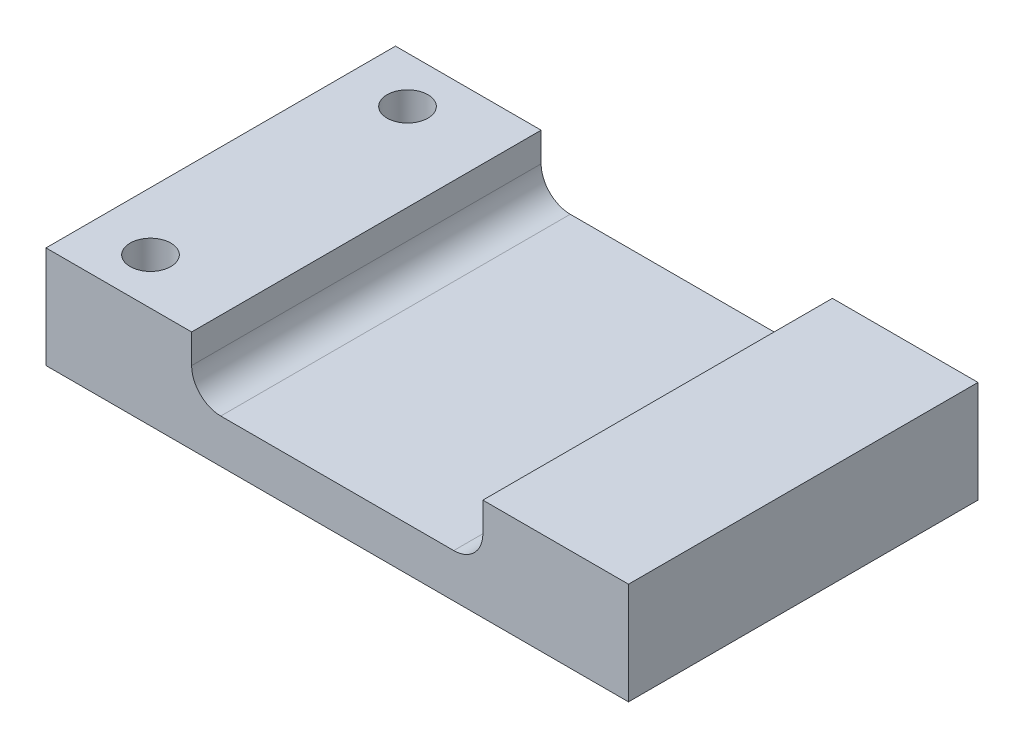
ISO-10303-21;
HEADER;
FILE_DESCRIPTION(('STEP AP214'),'2;1');
FILE_NAME('part.step','',(''),(''),'','','');
FILE_SCHEMA(('AUTOMOTIVE_DESIGN { 1 0 10303 214 1 1 1 1 }'));
ENDSEC;
DATA;
#1=APPLICATION_CONTEXT('core data for automotive mechanical design processes');
#2=APPLICATION_PROTOCOL_DEFINITION('international standard','automotive_design',2000,#1);
#3=PRODUCT_CONTEXT('',#1,'mechanical');
#4=PRODUCT('Part','Part','',(#3));
#5=PRODUCT_RELATED_PRODUCT_CATEGORY('part','',(#4));
#6=PRODUCT_DEFINITION_FORMATION('','',#4);
#7=PRODUCT_DEFINITION_CONTEXT('part definition',#1,'design');
#8=PRODUCT_DEFINITION('design','',#6,#7);
#9=PRODUCT_DEFINITION_SHAPE('','',#8);
#10=(LENGTH_UNIT() NAMED_UNIT(*) SI_UNIT(.MILLI.,.METRE.));
#11=(NAMED_UNIT(*) PLANE_ANGLE_UNIT() SI_UNIT($,.RADIAN.));
#12=(NAMED_UNIT(*) SI_UNIT($,.STERADIAN.) SOLID_ANGLE_UNIT());
#13=UNCERTAINTY_MEASURE_WITH_UNIT(LENGTH_MEASURE(1.E-05),#10,'distance_accuracy_value','');
#14=(GEOMETRIC_REPRESENTATION_CONTEXT(3) GLOBAL_UNCERTAINTY_ASSIGNED_CONTEXT((#13)) GLOBAL_UNIT_ASSIGNED_CONTEXT((#10,
#11,#12)) REPRESENTATION_CONTEXT('',''));
#15=CARTESIAN_POINT('',(0.,0.,0.));
#16=DIRECTION('',(0.,0.,1.));
#17=DIRECTION('',(1.,0.,0.));
#18=AXIS2_PLACEMENT_3D('',#15,#16,#17);
#19=CARTESIAN_POINT('',(-16.,7.,-8.825));
#20=DIRECTION('',(0.,-1.,0.));
#21=DIRECTION('',(0.,0.,-1.));
#22=AXIS2_PLACEMENT_3D('',#19,#20,#21);
#23=CYLINDRICAL_SURFACE('',#22,1.4);
#24=CARTESIAN_POINT('',(-16.,7.,-8.825));
#25=DIRECTION('',(0.,1.,0.));
#26=DIRECTION('',(0.,0.,1.));
#27=AXIS2_PLACEMENT_3D('',#24,#25,#26);
#28=CIRCLE('',#27,1.4);
#29=CARTESIAN_POINT('',(-16.,7.,-7.425));
#30=VERTEX_POINT('',#29);
#31=EDGE_CURVE('E307',#30,#30,#28,.T.);
#32=ORIENTED_EDGE('',*,*,#31,.T.);
#33=EDGE_LOOP('',(#32));
#34=FACE_BOUND('',#33,.T.);
#35=CARTESIAN_POINT('',(-16.,2.5,-8.825));
#36=DIRECTION('',(0.,-1.,0.));
#37=DIRECTION('',(0.,0.,-1.));
#38=AXIS2_PLACEMENT_3D('',#35,#36,#37);
#39=CIRCLE('',#38,1.4);
#40=CARTESIAN_POINT('',(-16.,2.5,-10.225));
#41=VERTEX_POINT('',#40);
#42=EDGE_CURVE('E37',#41,#41,#39,.T.);
#43=ORIENTED_EDGE('',*,*,#42,.T.);
#44=EDGE_LOOP('',(#43));
#45=FACE_BOUND('',#44,.T.);
#46=ADVANCED_FACE('F33',(#34,#45),#23,.F.);
#47=CARTESIAN_POINT('',(-16.,7.,8.825));
#48=DIRECTION('',(0.,-1.,0.));
#49=DIRECTION('',(0.,0.,-1.));
#50=AXIS2_PLACEMENT_3D('',#47,#48,#49);
#51=CYLINDRICAL_SURFACE('',#50,1.4);
#52=CARTESIAN_POINT('',(-16.,7.,8.825));
#53=DIRECTION('',(0.,1.,0.));
#54=DIRECTION('',(0.,0.,1.));
#55=AXIS2_PLACEMENT_3D('',#52,#53,#54);
#56=CIRCLE('',#55,1.4);
#57=CARTESIAN_POINT('',(-16.,7.,10.225));
#58=VERTEX_POINT('',#57);
#59=EDGE_CURVE('E299',#58,#58,#56,.T.);
#60=ORIENTED_EDGE('',*,*,#59,.T.);
#61=EDGE_LOOP('',(#60));
#62=FACE_BOUND('',#61,.T.);
#63=CARTESIAN_POINT('',(-16.,2.5,8.825));
#64=DIRECTION('',(0.,-1.,0.));
#65=DIRECTION('',(0.,0.,-1.));
#66=AXIS2_PLACEMENT_3D('',#63,#64,#65);
#67=CIRCLE('',#66,1.4);
#68=CARTESIAN_POINT('',(-16.,2.5,7.425));
#69=VERTEX_POINT('',#68);
#70=EDGE_CURVE('E274',#69,#69,#67,.T.);
#71=ORIENTED_EDGE('',*,*,#70,.T.);
#72=EDGE_LOOP('',(#71));
#73=FACE_BOUND('',#72,.T.);
#74=ADVANCED_FACE('F361',(#62,#73),#51,.F.);
#75=CARTESIAN_POINT('',(0.,7.,0.));
#76=DIRECTION('',(0.,1.,0.));
#77=DIRECTION('',(0.,0.,1.));
#78=AXIS2_PLACEMENT_3D('',#75,#76,#77);
#79=PLANE('',#78);
#80=DIRECTION('',(0.,0.,1.));
#81=VECTOR('',#80,1.);
#82=CARTESIAN_POINT('',(-9.99999999999999,7.,12.));
#83=LINE('',#82,#81);
#84=CARTESIAN_POINT('',(-10.,7.,-12.));
#85=VERTEX_POINT('',#84);
#86=CARTESIAN_POINT('',(-9.99999999999999,7.,12.));
#87=VERTEX_POINT('',#86);
#88=EDGE_CURVE('E292',#85,#87,#83,.T.);
#89=ORIENTED_EDGE('',*,*,#88,.F.);
#90=DIRECTION('',(-1.,0.,0.));
#91=VECTOR('',#90,1.);
#92=CARTESIAN_POINT('',(-20.,7.,-12.));
#93=LINE('',#92,#91);
#94=CARTESIAN_POINT('',(-20.,7.,-12.));
#95=VERTEX_POINT('',#94);
#96=EDGE_CURVE('E321',#85,#95,#93,.T.);
#97=ORIENTED_EDGE('',*,*,#96,.T.);
#98=DIRECTION('',(0.,0.,1.));
#99=VECTOR('',#98,1.);
#100=CARTESIAN_POINT('',(-20.,7.,-12.));
#101=LINE('',#100,#99);
#102=CARTESIAN_POINT('',(-20.,7.,12.));
#103=VERTEX_POINT('',#102);
#104=EDGE_CURVE('E311',#95,#103,#101,.T.);
#105=ORIENTED_EDGE('',*,*,#104,.T.);
#106=DIRECTION('',(1.,0.,0.));
#107=VECTOR('',#106,1.);
#108=CARTESIAN_POINT('',(-20.,7.,12.));
#109=LINE('',#108,#107);
#110=EDGE_CURVE('E316',#103,#87,#109,.T.);
#111=ORIENTED_EDGE('',*,*,#110,.T.);
#112=EDGE_LOOP('',(#89,#97,#105,#111));
#113=FACE_BOUND('',#112,.T.);
#114=ORIENTED_EDGE('',*,*,#31,.F.);
#115=EDGE_LOOP('',(#114));
#116=FACE_BOUND('',#115,.T.);
#117=ORIENTED_EDGE('',*,*,#59,.F.);
#118=EDGE_LOOP('',(#117));
#119=FACE_BOUND('',#118,.T.);
#120=ADVANCED_FACE('F422',(#113,#116,#119),#79,.T.);
#121=DIRECTION('',(0.,0.,-1.));
#122=VECTOR('',#121,1.);
#123=CARTESIAN_POINT('',(10.,7.,-12.));
#124=LINE('',#123,#122);
#125=CARTESIAN_POINT('',(10.,7.,12.));
#126=VERTEX_POINT('',#125);
#127=CARTESIAN_POINT('',(10.,7.,-12.));
#128=VERTEX_POINT('',#127);
#129=EDGE_CURVE('E288',#126,#128,#124,.T.);
#130=ORIENTED_EDGE('',*,*,#129,.F.);
#131=CARTESIAN_POINT('',(20.,7.,12.));
#132=VERTEX_POINT('',#131);
#133=EDGE_CURVE('E314',#126,#132,#109,.T.);
#134=ORIENTED_EDGE('',*,*,#133,.T.);
#135=DIRECTION('',(0.,0.,-1.));
#136=VECTOR('',#135,1.);
#137=CARTESIAN_POINT('',(20.,7.,-12.));
#138=LINE('',#137,#136);
#139=CARTESIAN_POINT('',(20.,7.,-12.));
#140=VERTEX_POINT('',#139);
#141=EDGE_CURVE('E319',#132,#140,#138,.T.);
#142=ORIENTED_EDGE('',*,*,#141,.T.);
#143=EDGE_CURVE('E322',#140,#128,#93,.T.);
#144=ORIENTED_EDGE('',*,*,#143,.T.);
#145=EDGE_LOOP('',(#130,#134,#142,#144));
#146=FACE_BOUND('',#145,.T.);
#147=ADVANCED_FACE('F394',(#146),#79,.T.);
#148=CARTESIAN_POINT('',(0.,0.,0.));
#149=DIRECTION('',(0.,1.,0.));
#150=DIRECTION('',(0.,0.,1.));
#151=AXIS2_PLACEMENT_3D('',#148,#149,#150);
#152=PLANE('',#151);
#153=DIRECTION('',(0.5,0.,0.866025403784439));
#154=VECTOR('',#153,1.);
#155=CARTESIAN_POINT('',(-14.498889300107,0.,-11.425));
#156=LINE('',#155,#154);
#157=CARTESIAN_POINT('',(-14.498889300107,0.,-11.425));
#158=VERTEX_POINT('',#157);
#159=CARTESIAN_POINT('',(-12.9977786002139,0.,-8.82500000000001));
#160=VERTEX_POINT('',#159);
#161=EDGE_CURVE('E218',#158,#160,#156,.T.);
#162=ORIENTED_EDGE('',*,*,#161,.F.);
#163=DIRECTION('',(1.,0.,0.));
#164=VECTOR('',#163,1.);
#165=CARTESIAN_POINT('',(-17.501110699893,0.,-11.425));
#166=LINE('',#165,#164);
#167=CARTESIAN_POINT('',(-17.501110699893,0.,-11.425));
#168=VERTEX_POINT('',#167);
#169=EDGE_CURVE('E50',#168,#158,#166,.T.);
#170=ORIENTED_EDGE('',*,*,#169,.F.);
#171=DIRECTION('',(0.5,0.,-0.866025403784439));
#172=VECTOR('',#171,1.);
#173=CARTESIAN_POINT('',(-19.0022213997861,0.,-8.825));
#174=LINE('',#173,#172);
#175=CARTESIAN_POINT('',(-19.0022213997861,0.,-8.825));
#176=VERTEX_POINT('',#175);
#177=EDGE_CURVE('E204',#176,#168,#174,.T.);
#178=ORIENTED_EDGE('',*,*,#177,.F.);
#179=DIRECTION('',(-0.5,0.,-0.866025403784438));
#180=VECTOR('',#179,1.);
#181=CARTESIAN_POINT('',(-17.501110699893,0.,-6.225));
#182=LINE('',#181,#180);
#183=CARTESIAN_POINT('',(-17.501110699893,0.,-6.225));
#184=VERTEX_POINT('',#183);
#185=EDGE_CURVE('E207',#184,#176,#182,.T.);
#186=ORIENTED_EDGE('',*,*,#185,.F.);
#187=DIRECTION('',(-1.,0.,0.));
#188=VECTOR('',#187,1.);
#189=CARTESIAN_POINT('',(-14.498889300107,0.,-6.225));
#190=LINE('',#189,#188);
#191=CARTESIAN_POINT('',(-14.498889300107,0.,-6.225));
#192=VERTEX_POINT('',#191);
#193=EDGE_CURVE('E223',#192,#184,#190,.T.);
#194=ORIENTED_EDGE('',*,*,#193,.F.);
#195=DIRECTION('',(-0.500000000000001,0.,0.866025403784438));
#196=VECTOR('',#195,1.);
#197=CARTESIAN_POINT('',(-12.9977786002139,0.,-8.82500000000001));
#198=LINE('',#197,#196);
#199=EDGE_CURVE('E220',#160,#192,#198,.T.);
#200=ORIENTED_EDGE('',*,*,#199,.F.);
#201=EDGE_LOOP('',(#162,#170,#178,#186,#194,#200));
#202=FACE_BOUND('',#201,.T.);
#203=DIRECTION('',(0.5,0.,0.866025403784438));
#204=VECTOR('',#203,1.);
#205=CARTESIAN_POINT('',(-14.498889300107,0.,6.225));
#206=LINE('',#205,#204);
#207=CARTESIAN_POINT('',(-14.498889300107,0.,6.225));
#208=VERTEX_POINT('',#207);
#209=CARTESIAN_POINT('',(-12.9977786002139,0.,8.825));
#210=VERTEX_POINT('',#209);
#211=EDGE_CURVE('E258',#208,#210,#206,.T.);
#212=ORIENTED_EDGE('',*,*,#211,.F.);
#213=DIRECTION('',(1.,0.,0.));
#214=VECTOR('',#213,1.);
#215=CARTESIAN_POINT('',(-17.501110699893,0.,6.225));
#216=LINE('',#215,#214);
#217=CARTESIAN_POINT('',(-17.501110699893,0.,6.225));
#218=VERTEX_POINT('',#217);
#219=EDGE_CURVE('E58',#218,#208,#216,.T.);
#220=ORIENTED_EDGE('',*,*,#219,.F.);
#221=DIRECTION('',(0.5,0.,-0.866025403784438));
#222=VECTOR('',#221,1.);
#223=CARTESIAN_POINT('',(-19.0022213997861,0.,8.825));
#224=LINE('',#223,#222);
#225=CARTESIAN_POINT('',(-19.0022213997861,0.,8.825));
#226=VERTEX_POINT('',#225);
#227=EDGE_CURVE('E241',#226,#218,#224,.T.);
#228=ORIENTED_EDGE('',*,*,#227,.F.);
#229=DIRECTION('',(-0.499999999999999,0.,-0.866025403784439));
#230=VECTOR('',#229,1.);
#231=CARTESIAN_POINT('',(-17.501110699893,0.,11.425));
#232=LINE('',#231,#230);
#233=CARTESIAN_POINT('',(-17.501110699893,0.,11.425));
#234=VERTEX_POINT('',#233);
#235=EDGE_CURVE('E267',#234,#226,#232,.T.);
#236=ORIENTED_EDGE('',*,*,#235,.F.);
#237=DIRECTION('',(-1.,0.,0.));
#238=VECTOR('',#237,1.);
#239=CARTESIAN_POINT('',(-14.498889300107,0.,11.425));
#240=LINE('',#239,#238);
#241=CARTESIAN_POINT('',(-14.498889300107,0.,11.425));
#242=VERTEX_POINT('',#241);
#243=EDGE_CURVE('E264',#242,#234,#240,.T.);
#244=ORIENTED_EDGE('',*,*,#243,.F.);
#245=DIRECTION('',(-0.5,0.,0.866025403784439));
#246=VECTOR('',#245,1.);
#247=CARTESIAN_POINT('',(-12.9977786002139,0.,8.825));
#248=LINE('',#247,#246);
#249=EDGE_CURVE('E261',#210,#242,#248,.T.);
#250=ORIENTED_EDGE('',*,*,#249,.F.);
#251=EDGE_LOOP('',(#212,#220,#228,#236,#244,#250));
#252=FACE_BOUND('',#251,.T.);
#253=DIRECTION('',(0.,0.,1.));
#254=VECTOR('',#253,1.);
#255=CARTESIAN_POINT('',(-20.,0.,-12.));
#256=LINE('',#255,#254);
#257=CARTESIAN_POINT('',(-20.,0.,-12.));
#258=VERTEX_POINT('',#257);
#259=CARTESIAN_POINT('',(-20.,0.,12.));
#260=VERTEX_POINT('',#259);
#261=EDGE_CURVE('E310',#258,#260,#256,.T.);
#262=ORIENTED_EDGE('',*,*,#261,.F.);
#263=DIRECTION('',(-1.,0.,0.));
#264=VECTOR('',#263,1.);
#265=CARTESIAN_POINT('',(-20.,0.,-12.));
#266=LINE('',#265,#264);
#267=CARTESIAN_POINT('',(20.,0.,-12.));
#268=VERTEX_POINT('',#267);
#269=EDGE_CURVE('E315',#268,#258,#266,.T.);
#270=ORIENTED_EDGE('',*,*,#269,.F.);
#271=DIRECTION('',(0.,0.,-1.));
#272=VECTOR('',#271,1.);
#273=CARTESIAN_POINT('',(20.,0.,-12.));
#274=LINE('',#273,#272);
#275=CARTESIAN_POINT('',(20.,0.,12.));
#276=VERTEX_POINT('',#275);
#277=EDGE_CURVE('E330',#276,#268,#274,.T.);
#278=ORIENTED_EDGE('',*,*,#277,.F.);
#279=DIRECTION('',(1.,0.,0.));
#280=VECTOR('',#279,1.);
#281=CARTESIAN_POINT('',(-20.,0.,12.));
#282=LINE('',#281,#280);
#283=EDGE_CURVE('E328',#260,#276,#282,.T.);
#284=ORIENTED_EDGE('',*,*,#283,.F.);
#285=EDGE_LOOP('',(#262,#270,#278,#284));
#286=FACE_BOUND('',#285,.T.);
#287=ADVANCED_FACE('F390',(#202,#252,#286),#152,.F.);
#288=CARTESIAN_POINT('',(-20.,7.,-12.));
#289=DIRECTION('',(1.,0.,0.));
#290=DIRECTION('',(0.,0.,-1.));
#291=AXIS2_PLACEMENT_3D('',#288,#289,#290);
#292=PLANE('',#291);
#293=ORIENTED_EDGE('',*,*,#261,.T.);
#294=DIRECTION('',(0.,-1.,0.));
#295=VECTOR('',#294,1.);
#296=CARTESIAN_POINT('',(-20.,7.,12.));
#297=LINE('',#296,#295);
#298=EDGE_CURVE('E341',#103,#260,#297,.T.);
#299=ORIENTED_EDGE('',*,*,#298,.F.);
#300=ORIENTED_EDGE('',*,*,#104,.F.);
#301=DIRECTION('',(0.,-1.,0.));
#302=VECTOR('',#301,1.);
#303=CARTESIAN_POINT('',(-20.,7.,-12.));
#304=LINE('',#303,#302);
#305=EDGE_CURVE('E325',#95,#258,#304,.T.);
#306=ORIENTED_EDGE('',*,*,#305,.T.);
#307=EDGE_LOOP('',(#293,#299,#300,#306));
#308=FACE_BOUND('',#307,.T.);
#309=ADVANCED_FACE('F393',(#308),#292,.F.);
#310=CARTESIAN_POINT('',(-20.,7.,12.));
#311=DIRECTION('',(0.,0.,-1.));
#312=DIRECTION('',(-1.,0.,0.));
#313=AXIS2_PLACEMENT_3D('',#310,#311,#312);
#314=PLANE('',#313);
#315=DIRECTION('',(1.,0.,0.));
#316=VECTOR('',#315,1.);
#317=CARTESIAN_POINT('',(10.,3.,12.));
#318=LINE('',#317,#316);
#319=CARTESIAN_POINT('',(-7.99999999999999,3.,12.));
#320=VERTEX_POINT('',#319);
#321=CARTESIAN_POINT('',(8.,3.,12.));
#322=VERTEX_POINT('',#321);
#323=EDGE_CURVE('E284',#320,#322,#318,.T.);
#324=ORIENTED_EDGE('',*,*,#323,.F.);
#325=CARTESIAN_POINT('',(-7.99999999999999,5.,12.));
#326=DIRECTION('',(0.,0.,-1.));
#327=DIRECTION('',(-1.,0.,0.));
#328=AXIS2_PLACEMENT_3D('',#325,#326,#327);
#329=CIRCLE('',#328,2.);
#330=CARTESIAN_POINT('',(-9.99999999999999,5.,12.));
#331=VERTEX_POINT('',#330);
#332=EDGE_CURVE('E42',#320,#331,#329,.T.);
#333=ORIENTED_EDGE('',*,*,#332,.T.);
#334=DIRECTION('',(0.,1.,0.));
#335=VECTOR('',#334,1.);
#336=CARTESIAN_POINT('',(-9.99999999999999,3.,12.));
#337=LINE('',#336,#335);
#338=EDGE_CURVE('E291',#331,#87,#337,.T.);
#339=ORIENTED_EDGE('',*,*,#338,.T.);
#340=ORIENTED_EDGE('',*,*,#110,.F.);
#341=ORIENTED_EDGE('',*,*,#298,.T.);
#342=ORIENTED_EDGE('',*,*,#283,.T.);
#343=DIRECTION('',(0.,-1.,0.));
#344=VECTOR('',#343,1.);
#345=CARTESIAN_POINT('',(20.,7.,12.));
#346=LINE('',#345,#344);
#347=EDGE_CURVE('E338',#132,#276,#346,.T.);
#348=ORIENTED_EDGE('',*,*,#347,.F.);
#349=ORIENTED_EDGE('',*,*,#133,.F.);
#350=DIRECTION('',(0.,1.,0.));
#351=VECTOR('',#350,1.);
#352=CARTESIAN_POINT('',(10.,3.,12.));
#353=LINE('',#352,#351);
#354=CARTESIAN_POINT('',(10.,5.,12.));
#355=VERTEX_POINT('',#354);
#356=EDGE_CURVE('E302',#355,#126,#353,.T.);
#357=ORIENTED_EDGE('',*,*,#356,.F.);
#358=CARTESIAN_POINT('',(8.,5.,12.));
#359=DIRECTION('',(0.,0.,-1.));
#360=DIRECTION('',(-1.,0.,0.));
#361=AXIS2_PLACEMENT_3D('',#358,#359,#360);
#362=CIRCLE('',#361,2.);
#363=EDGE_CURVE('E356',#355,#322,#362,.T.);
#364=ORIENTED_EDGE('',*,*,#363,.T.);
#365=EDGE_LOOP('',(#324,#333,#339,#340,#341,#342,#348,#349,#357,#364));
#366=FACE_BOUND('',#365,.T.);
#367=ADVANCED_FACE('F417',(#366),#314,.F.);
#368=CARTESIAN_POINT('',(20.,7.,-12.));
#369=DIRECTION('',(-1.,0.,0.));
#370=DIRECTION('',(0.,0.,1.));
#371=AXIS2_PLACEMENT_3D('',#368,#369,#370);
#372=PLANE('',#371);
#373=ORIENTED_EDGE('',*,*,#277,.T.);
#374=DIRECTION('',(0.,-1.,0.));
#375=VECTOR('',#374,1.);
#376=CARTESIAN_POINT('',(20.,7.,-12.));
#377=LINE('',#376,#375);
#378=EDGE_CURVE('E335',#140,#268,#377,.T.);
#379=ORIENTED_EDGE('',*,*,#378,.F.);
#380=ORIENTED_EDGE('',*,*,#141,.F.);
#381=ORIENTED_EDGE('',*,*,#347,.T.);
#382=EDGE_LOOP('',(#373,#379,#380,#381));
#383=FACE_BOUND('',#382,.T.);
#384=ADVANCED_FACE('F412',(#383),#372,.F.);
#385=CARTESIAN_POINT('',(-20.,7.,-12.));
#386=DIRECTION('',(0.,0.,1.));
#387=DIRECTION('',(1.,0.,0.));
#388=AXIS2_PLACEMENT_3D('',#385,#386,#387);
#389=PLANE('',#388);
#390=ORIENTED_EDGE('',*,*,#96,.F.);
#391=DIRECTION('',(0.,1.,0.));
#392=VECTOR('',#391,1.);
#393=CARTESIAN_POINT('',(-10.,3.,-12.));
#394=LINE('',#393,#392);
#395=CARTESIAN_POINT('',(-10.,5.,-12.));
#396=VERTEX_POINT('',#395);
#397=EDGE_CURVE('E297',#396,#85,#394,.T.);
#398=ORIENTED_EDGE('',*,*,#397,.F.);
#399=CARTESIAN_POINT('',(-8.,5.,-12.));
#400=DIRECTION('',(0.,0.,1.));
#401=DIRECTION('',(1.,0.,0.));
#402=AXIS2_PLACEMENT_3D('',#399,#400,#401);
#403=CIRCLE('',#402,2.);
#404=CARTESIAN_POINT('',(-8.,3.,-12.));
#405=VERTEX_POINT('',#404);
#406=EDGE_CURVE('E11',#396,#405,#403,.T.);
#407=ORIENTED_EDGE('',*,*,#406,.T.);
#408=DIRECTION('',(-1.,0.,0.));
#409=VECTOR('',#408,1.);
#410=CARTESIAN_POINT('',(-10.,3.,-12.));
#411=LINE('',#410,#409);
#412=CARTESIAN_POINT('',(8.,3.,-12.));
#413=VERTEX_POINT('',#412);
#414=EDGE_CURVE('E287',#413,#405,#411,.T.);
#415=ORIENTED_EDGE('',*,*,#414,.F.);
#416=CARTESIAN_POINT('',(8.,5.,-12.));
#417=DIRECTION('',(0.,0.,1.));
#418=DIRECTION('',(1.,0.,0.));
#419=AXIS2_PLACEMENT_3D('',#416,#417,#418);
#420=CIRCLE('',#419,2.);
#421=CARTESIAN_POINT('',(10.,5.,-12.));
#422=VERTEX_POINT('',#421);
#423=EDGE_CURVE('E354',#413,#422,#420,.T.);
#424=ORIENTED_EDGE('',*,*,#423,.T.);
#425=DIRECTION('',(0.,1.,0.));
#426=VECTOR('',#425,1.);
#427=CARTESIAN_POINT('',(10.,3.,-12.));
#428=LINE('',#427,#426);
#429=EDGE_CURVE('E300',#422,#128,#428,.T.);
#430=ORIENTED_EDGE('',*,*,#429,.T.);
#431=ORIENTED_EDGE('',*,*,#143,.F.);
#432=ORIENTED_EDGE('',*,*,#378,.T.);
#433=ORIENTED_EDGE('',*,*,#269,.T.);
#434=ORIENTED_EDGE('',*,*,#305,.F.);
#435=EDGE_LOOP('',(#390,#398,#407,#415,#424,#430,#431,#432,#433,#434));
#436=FACE_BOUND('',#435,.T.);
#437=ADVANCED_FACE('F406',(#436),#389,.F.);
#438=CARTESIAN_POINT('',(-9.99999999999999,3.,12.));
#439=DIRECTION('',(-1.,0.,0.));
#440=DIRECTION('',(0.,0.,1.));
#441=AXIS2_PLACEMENT_3D('',#438,#439,#440);
#442=PLANE('',#441);
#443=ORIENTED_EDGE('',*,*,#338,.F.);
#444=DIRECTION('',(0.,0.,1.));
#445=VECTOR('',#444,1.);
#446=CARTESIAN_POINT('',(-10.,5.,-12.));
#447=LINE('',#446,#445);
#448=EDGE_CURVE('E352',#331,#396,#447,.F.);
#449=ORIENTED_EDGE('',*,*,#448,.T.);
#450=ORIENTED_EDGE('',*,*,#397,.T.);
#451=ORIENTED_EDGE('',*,*,#88,.T.);
#452=EDGE_LOOP('',(#443,#449,#450,#451));
#453=FACE_BOUND('',#452,.T.);
#454=ADVANCED_FACE('F425',(#453),#442,.F.);
#455=CARTESIAN_POINT('',(10.,3.,-12.));
#456=DIRECTION('',(1.,0.,0.));
#457=DIRECTION('',(0.,0.,-1.));
#458=AXIS2_PLACEMENT_3D('',#455,#456,#457);
#459=PLANE('',#458);
#460=ORIENTED_EDGE('',*,*,#429,.F.);
#461=DIRECTION('',(0.,0.,-1.));
#462=VECTOR('',#461,1.);
#463=CARTESIAN_POINT('',(10.,5.,12.));
#464=LINE('',#463,#462);
#465=EDGE_CURVE('E350',#422,#355,#464,.F.);
#466=ORIENTED_EDGE('',*,*,#465,.T.);
#467=ORIENTED_EDGE('',*,*,#356,.T.);
#468=ORIENTED_EDGE('',*,*,#129,.T.);
#469=EDGE_LOOP('',(#460,#466,#467,#468));
#470=FACE_BOUND('',#469,.T.);
#471=ADVANCED_FACE('F440',(#470),#459,.F.);
#472=CARTESIAN_POINT('',(0.,3.,0.));
#473=DIRECTION('',(0.,-1.,0.));
#474=DIRECTION('',(0.,0.,-1.));
#475=AXIS2_PLACEMENT_3D('',#472,#473,#474);
#476=PLANE('',#475);
#477=ORIENTED_EDGE('',*,*,#323,.T.);
#478=DIRECTION('',(0.,0.,-1.));
#479=VECTOR('',#478,1.);
#480=CARTESIAN_POINT('',(8.,3.,-12.));
#481=LINE('',#480,#479);
#482=EDGE_CURVE('E347',#322,#413,#481,.T.);
#483=ORIENTED_EDGE('',*,*,#482,.T.);
#484=ORIENTED_EDGE('',*,*,#414,.T.);
#485=DIRECTION('',(0.,0.,1.));
#486=VECTOR('',#485,1.);
#487=CARTESIAN_POINT('',(-7.99999999999999,3.,12.));
#488=LINE('',#487,#486);
#489=EDGE_CURVE('E344',#405,#320,#488,.T.);
#490=ORIENTED_EDGE('',*,*,#489,.T.);
#491=EDGE_LOOP('',(#477,#483,#484,#490));
#492=FACE_BOUND('',#491,.T.);
#493=ADVANCED_FACE('F432',(#492),#476,.F.);
#494=CARTESIAN_POINT('',(8.,5.,0.));
#495=DIRECTION('',(0.,0.,1.));
#496=DIRECTION('',(1.,0.,0.));
#497=AXIS2_PLACEMENT_3D('',#494,#495,#496);
#498=CYLINDRICAL_SURFACE('',#497,2.);
#499=ORIENTED_EDGE('',*,*,#363,.F.);
#500=ORIENTED_EDGE('',*,*,#465,.F.);
#501=ORIENTED_EDGE('',*,*,#423,.F.);
#502=ORIENTED_EDGE('',*,*,#482,.F.);
#503=EDGE_LOOP('',(#499,#500,#501,#502));
#504=FACE_BOUND('',#503,.T.);
#505=ADVANCED_FACE('F437',(#504),#498,.F.);
#506=CARTESIAN_POINT('',(-8.,5.,0.));
#507=DIRECTION('',(0.,0.,-1.));
#508=DIRECTION('',(-1.,0.,0.));
#509=AXIS2_PLACEMENT_3D('',#506,#507,#508);
#510=CYLINDRICAL_SURFACE('',#509,2.);
#511=ORIENTED_EDGE('',*,*,#406,.F.);
#512=ORIENTED_EDGE('',*,*,#448,.F.);
#513=ORIENTED_EDGE('',*,*,#332,.F.);
#514=ORIENTED_EDGE('',*,*,#489,.F.);
#515=EDGE_LOOP('',(#511,#512,#513,#514));
#516=FACE_BOUND('',#515,.T.);
#517=ADVANCED_FACE('F35',(#516),#510,.F.);
#518=CARTESIAN_POINT('',(-17.501110699893,2.5,6.225));
#519=DIRECTION('',(0.,0.,-1.));
#520=DIRECTION('',(-1.,0.,0.));
#521=AXIS2_PLACEMENT_3D('',#518,#519,#520);
#522=PLANE('',#521);
#523=ORIENTED_EDGE('',*,*,#219,.T.);
#524=DIRECTION('',(0.,-1.,0.));
#525=VECTOR('',#524,1.);
#526=CARTESIAN_POINT('',(-14.498889300107,2.5,6.225));
#527=LINE('',#526,#525);
#528=CARTESIAN_POINT('',(-14.498889300107,2.5,6.225));
#529=VERTEX_POINT('',#528);
#530=EDGE_CURVE('E256',#529,#208,#527,.T.);
#531=ORIENTED_EDGE('',*,*,#530,.F.);
#532=DIRECTION('',(1.,0.,0.));
#533=VECTOR('',#532,1.);
#534=CARTESIAN_POINT('',(-17.501110699893,2.5,6.225));
#535=LINE('',#534,#533);
#536=CARTESIAN_POINT('',(-17.501110699893,2.5,6.225));
#537=VERTEX_POINT('',#536);
#538=EDGE_CURVE('E237',#537,#529,#535,.T.);
#539=ORIENTED_EDGE('',*,*,#538,.F.);
#540=DIRECTION('',(0.,-1.,0.));
#541=VECTOR('',#540,1.);
#542=CARTESIAN_POINT('',(-17.501110699893,2.5,6.225));
#543=LINE('',#542,#541);
#544=EDGE_CURVE('E272',#537,#218,#543,.T.);
#545=ORIENTED_EDGE('',*,*,#544,.T.);
#546=EDGE_LOOP('',(#523,#531,#539,#545));
#547=FACE_BOUND('',#546,.T.);
#548=ADVANCED_FACE('F371',(#547),#522,.F.);
#549=CARTESIAN_POINT('',(-19.0022213997861,2.5,8.825));
#550=DIRECTION('',(-0.866025403784439,0.,-0.5));
#551=DIRECTION('',(-0.5,0.,0.866025403784439));
#552=AXIS2_PLACEMENT_3D('',#549,#550,#551);
#553=PLANE('',#552);
#554=ORIENTED_EDGE('',*,*,#227,.T.);
#555=ORIENTED_EDGE('',*,*,#544,.F.);
#556=DIRECTION('',(0.5,0.,-0.866025403784438));
#557=VECTOR('',#556,1.);
#558=CARTESIAN_POINT('',(-19.0022213997861,2.5,8.825));
#559=LINE('',#558,#557);
#560=CARTESIAN_POINT('',(-19.0022213997861,2.5,8.825));
#561=VERTEX_POINT('',#560);
#562=EDGE_CURVE('E253',#561,#537,#559,.T.);
#563=ORIENTED_EDGE('',*,*,#562,.F.);
#564=DIRECTION('',(0.,-1.,0.));
#565=VECTOR('',#564,1.);
#566=CARTESIAN_POINT('',(-19.0022213997861,2.5,8.825));
#567=LINE('',#566,#565);
#568=EDGE_CURVE('E275',#561,#226,#567,.T.);
#569=ORIENTED_EDGE('',*,*,#568,.T.);
#570=EDGE_LOOP('',(#554,#555,#563,#569));
#571=FACE_BOUND('',#570,.T.);
#572=ADVANCED_FACE('F388',(#571),#553,.F.);
#573=CARTESIAN_POINT('',(-17.501110699893,2.5,11.425));
#574=DIRECTION('',(-0.866025403784439,0.,0.499999999999999));
#575=DIRECTION('',(0.499999999999999,0.,0.866025403784439));
#576=AXIS2_PLACEMENT_3D('',#573,#574,#575);
#577=PLANE('',#576);
#578=ORIENTED_EDGE('',*,*,#235,.T.);
#579=ORIENTED_EDGE('',*,*,#568,.F.);
#580=DIRECTION('',(-0.499999999999999,0.,-0.866025403784439));
#581=VECTOR('',#580,1.);
#582=CARTESIAN_POINT('',(-17.501110699893,2.5,11.425));
#583=LINE('',#582,#581);
#584=CARTESIAN_POINT('',(-17.501110699893,2.5,11.425));
#585=VERTEX_POINT('',#584);
#586=EDGE_CURVE('E250',#585,#561,#583,.T.);
#587=ORIENTED_EDGE('',*,*,#586,.F.);
#588=DIRECTION('',(0.,-1.,0.));
#589=VECTOR('',#588,1.);
#590=CARTESIAN_POINT('',(-17.501110699893,2.5,11.425));
#591=LINE('',#590,#589);
#592=EDGE_CURVE('E277',#585,#234,#591,.T.);
#593=ORIENTED_EDGE('',*,*,#592,.T.);
#594=EDGE_LOOP('',(#578,#579,#587,#593));
#595=FACE_BOUND('',#594,.T.);
#596=ADVANCED_FACE('F385',(#595),#577,.F.);
#597=CARTESIAN_POINT('',(-14.498889300107,2.5,11.425));
#598=DIRECTION('',(0.,0.,1.));
#599=DIRECTION('',(1.,0.,0.));
#600=AXIS2_PLACEMENT_3D('',#597,#598,#599);
#601=PLANE('',#600);
#602=ORIENTED_EDGE('',*,*,#243,.T.);
#603=ORIENTED_EDGE('',*,*,#592,.F.);
#604=DIRECTION('',(-1.,0.,0.));
#605=VECTOR('',#604,1.);
#606=CARTESIAN_POINT('',(-14.498889300107,2.5,11.425));
#607=LINE('',#606,#605);
#608=CARTESIAN_POINT('',(-14.498889300107,2.5,11.425));
#609=VERTEX_POINT('',#608);
#610=EDGE_CURVE('E247',#609,#585,#607,.T.);
#611=ORIENTED_EDGE('',*,*,#610,.F.);
#612=DIRECTION('',(0.,-1.,0.));
#613=VECTOR('',#612,1.);
#614=CARTESIAN_POINT('',(-14.498889300107,2.5,11.425));
#615=LINE('',#614,#613);
#616=EDGE_CURVE('E279',#609,#242,#615,.T.);
#617=ORIENTED_EDGE('',*,*,#616,.T.);
#618=EDGE_LOOP('',(#602,#603,#611,#617));
#619=FACE_BOUND('',#618,.T.);
#620=ADVANCED_FACE('F381',(#619),#601,.F.);
#621=CARTESIAN_POINT('',(-12.9977786002139,2.5,8.825));
#622=DIRECTION('',(0.866025403784439,0.,0.5));
#623=DIRECTION('',(0.5,0.,-0.866025403784439));
#624=AXIS2_PLACEMENT_3D('',#621,#622,#623);
#625=PLANE('',#624);
#626=ORIENTED_EDGE('',*,*,#249,.T.);
#627=ORIENTED_EDGE('',*,*,#616,.F.);
#628=DIRECTION('',(-0.5,0.,0.866025403784439));
#629=VECTOR('',#628,1.);
#630=CARTESIAN_POINT('',(-12.9977786002139,2.5,8.825));
#631=LINE('',#630,#629);
#632=CARTESIAN_POINT('',(-12.9977786002139,2.5,8.825));
#633=VERTEX_POINT('',#632);
#634=EDGE_CURVE('E244',#633,#609,#631,.T.);
#635=ORIENTED_EDGE('',*,*,#634,.F.);
#636=DIRECTION('',(0.,-1.,0.));
#637=VECTOR('',#636,1.);
#638=CARTESIAN_POINT('',(-12.9977786002139,2.5,8.825));
#639=LINE('',#638,#637);
#640=EDGE_CURVE('E281',#633,#210,#639,.T.);
#641=ORIENTED_EDGE('',*,*,#640,.T.);
#642=EDGE_LOOP('',(#626,#627,#635,#641));
#643=FACE_BOUND('',#642,.T.);
#644=ADVANCED_FACE('F377',(#643),#625,.F.);
#645=CARTESIAN_POINT('',(-14.498889300107,2.5,6.225));
#646=DIRECTION('',(0.866025403784438,0.,-0.5));
#647=DIRECTION('',(-0.5,0.,-0.866025403784438));
#648=AXIS2_PLACEMENT_3D('',#645,#646,#647);
#649=PLANE('',#648);
#650=ORIENTED_EDGE('',*,*,#211,.T.);
#651=ORIENTED_EDGE('',*,*,#640,.F.);
#652=DIRECTION('',(0.5,0.,0.866025403784438));
#653=VECTOR('',#652,1.);
#654=CARTESIAN_POINT('',(-14.498889300107,2.5,6.225));
#655=LINE('',#654,#653);
#656=EDGE_CURVE('E240',#529,#633,#655,.T.);
#657=ORIENTED_EDGE('',*,*,#656,.F.);
#658=ORIENTED_EDGE('',*,*,#530,.T.);
#659=EDGE_LOOP('',(#650,#651,#657,#658));
#660=FACE_BOUND('',#659,.T.);
#661=ADVANCED_FACE('F366',(#660),#649,.F.);
#662=CARTESIAN_POINT('',(0.,2.5,0.));
#663=DIRECTION('',(0.,-1.,0.));
#664=DIRECTION('',(0.,0.,-1.));
#665=AXIS2_PLACEMENT_3D('',#662,#663,#664);
#666=PLANE('',#665);
#667=ORIENTED_EDGE('',*,*,#70,.F.);
#668=EDGE_LOOP('',(#667));
#669=FACE_BOUND('',#668,.T.);
#670=ORIENTED_EDGE('',*,*,#538,.T.);
#671=ORIENTED_EDGE('',*,*,#656,.T.);
#672=ORIENTED_EDGE('',*,*,#634,.T.);
#673=ORIENTED_EDGE('',*,*,#610,.T.);
#674=ORIENTED_EDGE('',*,*,#586,.T.);
#675=ORIENTED_EDGE('',*,*,#562,.T.);
#676=EDGE_LOOP('',(#670,#671,#672,#673,#674,#675));
#677=FACE_BOUND('',#676,.T.);
#678=ADVANCED_FACE('F363',(#669,#677),#666,.T.);
#679=CARTESIAN_POINT('',(-17.501110699893,2.5,-11.425));
#680=DIRECTION('',(0.,0.,-1.));
#681=DIRECTION('',(-1.,0.,0.));
#682=AXIS2_PLACEMENT_3D('',#679,#680,#681);
#683=PLANE('',#682);
#684=ORIENTED_EDGE('',*,*,#169,.T.);
#685=DIRECTION('',(0.,-1.,0.));
#686=VECTOR('',#685,1.);
#687=CARTESIAN_POINT('',(-14.498889300107,2.5,-11.425));
#688=LINE('',#687,#686);
#689=CARTESIAN_POINT('',(-14.498889300107,2.5,-11.425));
#690=VERTEX_POINT('',#689);
#691=EDGE_CURVE('E181',#690,#158,#688,.T.);
#692=ORIENTED_EDGE('',*,*,#691,.F.);
#693=DIRECTION('',(1.,0.,0.));
#694=VECTOR('',#693,1.);
#695=CARTESIAN_POINT('',(-17.501110699893,2.5,-11.425));
#696=LINE('',#695,#694);
#697=CARTESIAN_POINT('',(-17.501110699893,2.5,-11.425));
#698=VERTEX_POINT('',#697);
#699=EDGE_CURVE('E185',#698,#690,#696,.T.);
#700=ORIENTED_EDGE('',*,*,#699,.F.);
#701=DIRECTION('',(0.,-1.,0.));
#702=VECTOR('',#701,1.);
#703=CARTESIAN_POINT('',(-17.501110699893,2.5,-11.425));
#704=LINE('',#703,#702);
#705=EDGE_CURVE('E228',#698,#168,#704,.T.);
#706=ORIENTED_EDGE('',*,*,#705,.T.);
#707=EDGE_LOOP('',(#684,#692,#700,#706));
#708=FACE_BOUND('',#707,.T.);
#709=ADVANCED_FACE('F183',(#708),#683,.F.);
#710=CARTESIAN_POINT('',(-19.0022213997861,2.5,-8.825));
#711=DIRECTION('',(-0.866025403784438,0.,-0.5));
#712=DIRECTION('',(-0.5,0.,0.866025403784439));
#713=AXIS2_PLACEMENT_3D('',#710,#711,#712);
#714=PLANE('',#713);
#715=ORIENTED_EDGE('',*,*,#177,.T.);
#716=ORIENTED_EDGE('',*,*,#705,.F.);
#717=DIRECTION('',(0.5,0.,-0.866025403784439));
#718=VECTOR('',#717,1.);
#719=CARTESIAN_POINT('',(-19.0022213997861,2.5,-8.825));
#720=LINE('',#719,#718);
#721=CARTESIAN_POINT('',(-19.0022213997861,2.5,-8.825));
#722=VERTEX_POINT('',#721);
#723=EDGE_CURVE('E191',#722,#698,#720,.T.);
#724=ORIENTED_EDGE('',*,*,#723,.F.);
#725=DIRECTION('',(0.,-1.,0.));
#726=VECTOR('',#725,1.);
#727=CARTESIAN_POINT('',(-19.0022213997861,2.5,-8.825));
#728=LINE('',#727,#726);
#729=EDGE_CURVE('E230',#722,#176,#728,.T.);
#730=ORIENTED_EDGE('',*,*,#729,.T.);
#731=EDGE_LOOP('',(#715,#716,#724,#730));
#732=FACE_BOUND('',#731,.T.);
#733=ADVANCED_FACE('F478',(#732),#714,.F.);
#734=CARTESIAN_POINT('',(-17.501110699893,2.5,-6.225));
#735=DIRECTION('',(-0.866025403784438,0.,0.5));
#736=DIRECTION('',(0.5,0.,0.866025403784439));
#737=AXIS2_PLACEMENT_3D('',#734,#735,#736);
#738=PLANE('',#737);
#739=ORIENTED_EDGE('',*,*,#185,.T.);
#740=ORIENTED_EDGE('',*,*,#729,.F.);
#741=DIRECTION('',(-0.5,0.,-0.866025403784438));
#742=VECTOR('',#741,1.);
#743=CARTESIAN_POINT('',(-17.501110699893,2.5,-6.225));
#744=LINE('',#743,#742);
#745=CARTESIAN_POINT('',(-17.501110699893,2.5,-6.225));
#746=VERTEX_POINT('',#745);
#747=EDGE_CURVE('E214',#746,#722,#744,.T.);
#748=ORIENTED_EDGE('',*,*,#747,.F.);
#749=DIRECTION('',(0.,-1.,0.));
#750=VECTOR('',#749,1.);
#751=CARTESIAN_POINT('',(-17.501110699893,2.5,-6.225));
#752=LINE('',#751,#750);
#753=EDGE_CURVE('E232',#746,#184,#752,.T.);
#754=ORIENTED_EDGE('',*,*,#753,.T.);
#755=EDGE_LOOP('',(#739,#740,#748,#754));
#756=FACE_BOUND('',#755,.T.);
#757=ADVANCED_FACE('F488',(#756),#738,.F.);
#758=CARTESIAN_POINT('',(-14.498889300107,2.5,-6.225));
#759=DIRECTION('',(0.,0.,1.));
#760=DIRECTION('',(1.,0.,0.));
#761=AXIS2_PLACEMENT_3D('',#758,#759,#760);
#762=PLANE('',#761);
#763=ORIENTED_EDGE('',*,*,#193,.T.);
#764=ORIENTED_EDGE('',*,*,#753,.F.);
#765=DIRECTION('',(-1.,0.,0.));
#766=VECTOR('',#765,1.);
#767=CARTESIAN_POINT('',(-14.498889300107,2.5,-6.225));
#768=LINE('',#767,#766);
#769=CARTESIAN_POINT('',(-14.498889300107,2.5,-6.225));
#770=VERTEX_POINT('',#769);
#771=EDGE_CURVE('E211',#770,#746,#768,.T.);
#772=ORIENTED_EDGE('',*,*,#771,.F.);
#773=DIRECTION('',(0.,-1.,0.));
#774=VECTOR('',#773,1.);
#775=CARTESIAN_POINT('',(-14.498889300107,2.5,-6.225));
#776=LINE('',#775,#774);
#777=EDGE_CURVE('E234',#770,#192,#776,.T.);
#778=ORIENTED_EDGE('',*,*,#777,.T.);
#779=EDGE_LOOP('',(#763,#764,#772,#778));
#780=FACE_BOUND('',#779,.T.);
#781=ADVANCED_FACE('F484',(#780),#762,.F.);
#782=CARTESIAN_POINT('',(-12.9977786002139,2.5,-8.82500000000001));
#783=DIRECTION('',(0.866025403784438,0.,0.500000000000001));
#784=DIRECTION('',(0.500000000000001,0.,-0.866025403784438));
#785=AXIS2_PLACEMENT_3D('',#782,#783,#784);
#786=PLANE('',#785);
#787=ORIENTED_EDGE('',*,*,#199,.T.);
#788=ORIENTED_EDGE('',*,*,#777,.F.);
#789=DIRECTION('',(-0.500000000000001,0.,0.866025403784438));
#790=VECTOR('',#789,1.);
#791=CARTESIAN_POINT('',(-12.9977786002139,2.5,-8.82500000000001));
#792=LINE('',#791,#790);
#793=CARTESIAN_POINT('',(-12.9977786002139,2.5,-8.82500000000001));
#794=VERTEX_POINT('',#793);
#795=EDGE_CURVE('E199',#794,#770,#792,.T.);
#796=ORIENTED_EDGE('',*,*,#795,.F.);
#797=DIRECTION('',(0.,-1.,0.));
#798=VECTOR('',#797,1.);
#799=CARTESIAN_POINT('',(-12.9977786002139,2.5,-8.82500000000001));
#800=LINE('',#799,#798);
#801=EDGE_CURVE('E190',#794,#160,#800,.T.);
#802=ORIENTED_EDGE('',*,*,#801,.T.);
#803=EDGE_LOOP('',(#787,#788,#796,#802));
#804=FACE_BOUND('',#803,.T.);
#805=ADVANCED_FACE('F481',(#804),#786,.F.);
#806=CARTESIAN_POINT('',(-14.498889300107,2.5,-11.425));
#807=DIRECTION('',(0.866025403784438,0.,-0.5));
#808=DIRECTION('',(-0.5,0.,-0.866025403784439));
#809=AXIS2_PLACEMENT_3D('',#806,#807,#808);
#810=PLANE('',#809);
#811=ORIENTED_EDGE('',*,*,#161,.T.);
#812=ORIENTED_EDGE('',*,*,#801,.F.);
#813=DIRECTION('',(0.5,0.,0.866025403784439));
#814=VECTOR('',#813,1.);
#815=CARTESIAN_POINT('',(-14.498889300107,2.5,-11.425));
#816=LINE('',#815,#814);
#817=EDGE_CURVE('E194',#690,#794,#816,.T.);
#818=ORIENTED_EDGE('',*,*,#817,.F.);
#819=ORIENTED_EDGE('',*,*,#691,.T.);
#820=EDGE_LOOP('',(#811,#812,#818,#819));
#821=FACE_BOUND('',#820,.T.);
#822=ADVANCED_FACE('F195',(#821),#810,.F.);
#823=CARTESIAN_POINT('',(0.,2.5,0.));
#824=DIRECTION('',(0.,-1.,0.));
#825=DIRECTION('',(0.,0.,-1.));
#826=AXIS2_PLACEMENT_3D('',#823,#824,#825);
#827=PLANE('',#826);
#828=ORIENTED_EDGE('',*,*,#42,.F.);
#829=EDGE_LOOP('',(#828));
#830=FACE_BOUND('',#829,.T.);
#831=ORIENTED_EDGE('',*,*,#699,.T.);
#832=ORIENTED_EDGE('',*,*,#817,.T.);
#833=ORIENTED_EDGE('',*,*,#795,.T.);
#834=ORIENTED_EDGE('',*,*,#771,.T.);
#835=ORIENTED_EDGE('',*,*,#747,.T.);
#836=ORIENTED_EDGE('',*,*,#723,.T.);
#837=EDGE_LOOP('',(#831,#832,#833,#834,#835,#836));
#838=FACE_BOUND('',#837,.T.);
#839=ADVANCED_FACE('F201',(#830,#838),#827,.T.);
#840=CLOSED_SHELL('',(#46,#74,#120,#147,#287,#309,#367,#384,#437,#454,#471,#493,#505,#517,#548,
#572,#596,#620,#644,#661,#678,#709,#733,#757,#781,#805,#822,#839));
#841=MANIFOLD_SOLID_BREP('B2',#840);
#842=ADVANCED_BREP_SHAPE_REPRESENTATION('',(#18,#841),#14);
#843=SHAPE_DEFINITION_REPRESENTATION(#9,#842);
ENDSEC;
END-ISO-10303-21;
